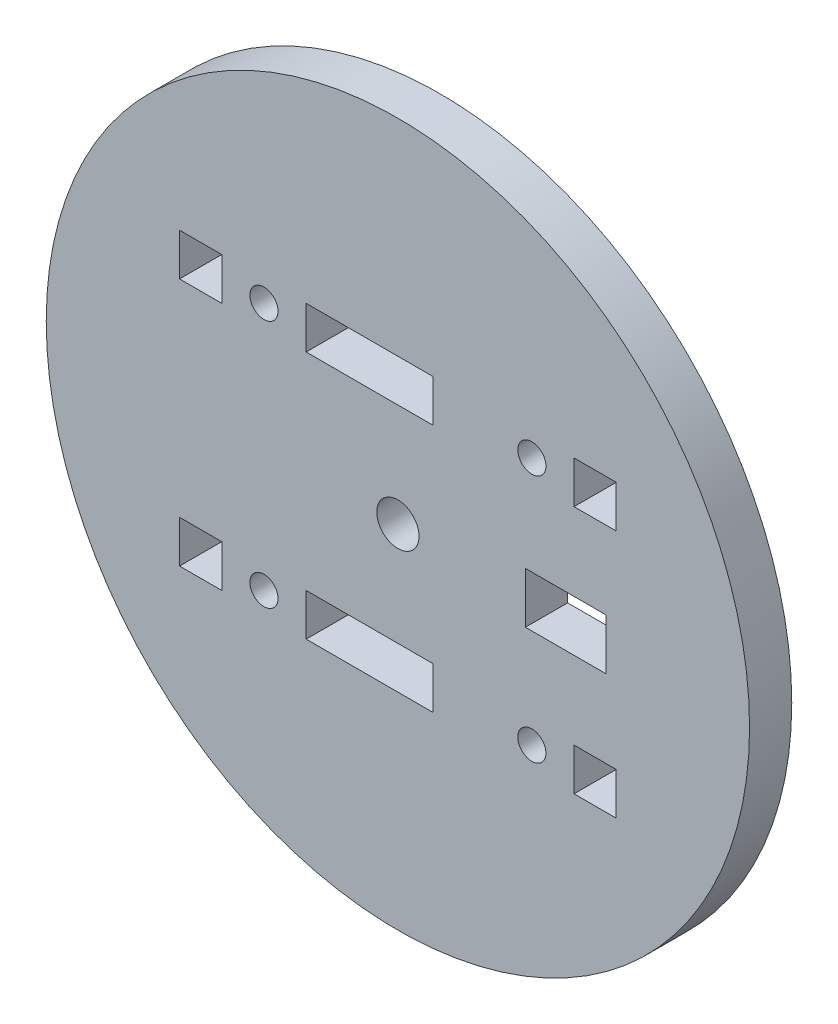
ISO-10303-21;
HEADER;
FILE_DESCRIPTION(('STEP AP214'),'2;1');
FILE_NAME('part.step','',(''),(''),'','','');
FILE_SCHEMA(('AUTOMOTIVE_DESIGN { 1 0 10303 214 1 1 1 1 }'));
ENDSEC;
DATA;
#1=APPLICATION_CONTEXT('core data for automotive mechanical design processes');
#2=APPLICATION_PROTOCOL_DEFINITION('international standard','automotive_design',2000,#1);
#3=PRODUCT_CONTEXT('',#1,'mechanical');
#4=PRODUCT('Part','Part','',(#3));
#5=PRODUCT_RELATED_PRODUCT_CATEGORY('part','',(#4));
#6=PRODUCT_DEFINITION_FORMATION('','',#4);
#7=PRODUCT_DEFINITION_CONTEXT('part definition',#1,'design');
#8=PRODUCT_DEFINITION('design','',#6,#7);
#9=PRODUCT_DEFINITION_SHAPE('','',#8);
#10=(LENGTH_UNIT() NAMED_UNIT(*) SI_UNIT(.MILLI.,.METRE.));
#11=(NAMED_UNIT(*) PLANE_ANGLE_UNIT() SI_UNIT($,.RADIAN.));
#12=(NAMED_UNIT(*) SI_UNIT($,.STERADIAN.) SOLID_ANGLE_UNIT());
#13=UNCERTAINTY_MEASURE_WITH_UNIT(LENGTH_MEASURE(1.E-05),#10,'distance_accuracy_value','');
#14=(GEOMETRIC_REPRESENTATION_CONTEXT(3) GLOBAL_UNCERTAINTY_ASSIGNED_CONTEXT((#13)) GLOBAL_UNIT_ASSIGNED_CONTEXT((#10,
#11,#12)) REPRESENTATION_CONTEXT('',''));
#15=CARTESIAN_POINT('',(0.,0.,0.));
#16=DIRECTION('',(0.,0.,1.));
#17=DIRECTION('',(1.,0.,0.));
#18=AXIS2_PLACEMENT_3D('',#15,#16,#17);
#19=CARTESIAN_POINT('',(0.,0.,15.));
#20=DIRECTION('',(0.,0.,1.));
#21=DIRECTION('',(1.,0.,0.));
#22=AXIS2_PLACEMENT_3D('',#19,#20,#21);
#23=PLANE('',#22);
#24=CARTESIAN_POINT('',(-47.6102535255947,-44.1941738241591,15.));
#25=DIRECTION('',(0.,0.,-1.));
#26=DIRECTION('',(1.,0.,0.));
#27=AXIS2_PLACEMENT_3D('',#24,#25,#26);
#28=CIRCLE('',#27,5.);
#29=CARTESIAN_POINT('',(-42.6102535255947,-44.1941738241591,15.));
#30=VERTEX_POINT('',#29);
#31=EDGE_CURVE('E250',#30,#30,#28,.T.);
#32=ORIENTED_EDGE('',*,*,#31,.T.);
#33=EDGE_LOOP('',(#32));
#34=FACE_BOUND('',#33,.T.);
#35=CARTESIAN_POINT('',(47.6102535255947,-44.1941738241591,15.));
#36=DIRECTION('',(0.,0.,-1.));
#37=DIRECTION('',(1.,0.,0.));
#38=AXIS2_PLACEMENT_3D('',#35,#36,#37);
#39=CIRCLE('',#38,5.);
#40=CARTESIAN_POINT('',(52.6102535255947,-44.1941738241591,15.));
#41=VERTEX_POINT('',#40);
#42=EDGE_CURVE('E257',#41,#41,#39,.T.);
#43=ORIENTED_EDGE('',*,*,#42,.T.);
#44=EDGE_LOOP('',(#43));
#45=FACE_BOUND('',#44,.T.);
#46=DIRECTION('',(-1.,0.,0.));
#47=VECTOR('',#46,1.);
#48=CARTESIAN_POINT('',(-32.6102535255947,51.6941738241591,15.));
#49=LINE('',#48,#47);
#50=CARTESIAN_POINT('',(12.3897464744053,51.6941738241591,15.));
#51=VERTEX_POINT('',#50);
#52=CARTESIAN_POINT('',(-32.6102535255947,51.6941738241591,15.));
#53=VERTEX_POINT('',#52);
#54=EDGE_CURVE('E321',#51,#53,#49,.T.);
#55=ORIENTED_EDGE('',*,*,#54,.F.);
#56=DIRECTION('',(0.,1.,0.));
#57=VECTOR('',#56,1.);
#58=CARTESIAN_POINT('',(12.3897464744053,51.6941738241591,15.));
#59=LINE('',#58,#57);
#60=CARTESIAN_POINT('',(12.3897464744053,36.6941738241591,15.));
#61=VERTEX_POINT('',#60);
#62=EDGE_CURVE('E332',#61,#51,#59,.T.);
#63=ORIENTED_EDGE('',*,*,#62,.F.);
#64=DIRECTION('',(1.,0.,0.));
#65=VECTOR('',#64,1.);
#66=CARTESIAN_POINT('',(-32.6102535255947,36.6941738241591,15.));
#67=LINE('',#66,#65);
#68=CARTESIAN_POINT('',(-32.6102535255947,36.6941738241591,15.));
#69=VERTEX_POINT('',#68);
#70=EDGE_CURVE('E346',#69,#61,#67,.T.);
#71=ORIENTED_EDGE('',*,*,#70,.F.);
#72=DIRECTION('',(0.,-1.,0.));
#73=VECTOR('',#72,1.);
#74=CARTESIAN_POINT('',(-32.6102535255947,51.6941738241591,15.));
#75=LINE('',#74,#73);
#76=EDGE_CURVE('E343',#53,#69,#75,.T.);
#77=ORIENTED_EDGE('',*,*,#76,.F.);
#78=EDGE_LOOP('',(#55,#63,#71,#77));
#79=FACE_BOUND('',#78,.T.);
#80=CARTESIAN_POINT('',(-47.6102535255947,44.1941738241591,15.));
#81=DIRECTION('',(0.,0.,1.));
#82=DIRECTION('',(1.,0.,0.));
#83=AXIS2_PLACEMENT_3D('',#80,#81,#82);
#84=CIRCLE('',#83,5.);
#85=CARTESIAN_POINT('',(-42.6102535255947,44.1941738241591,15.));
#86=VERTEX_POINT('',#85);
#87=EDGE_CURVE('E353',#86,#86,#84,.T.);
#88=ORIENTED_EDGE('',*,*,#87,.F.);
#89=EDGE_LOOP('',(#88));
#90=FACE_BOUND('',#89,.T.);
#91=CARTESIAN_POINT('',(47.6102535255947,44.1941738241591,15.));
#92=DIRECTION('',(0.,0.,1.));
#93=DIRECTION('',(1.,0.,0.));
#94=AXIS2_PLACEMENT_3D('',#91,#92,#93);
#95=CIRCLE('',#94,5.);
#96=CARTESIAN_POINT('',(52.6102535255947,44.1941738241591,15.));
#97=VERTEX_POINT('',#96);
#98=EDGE_CURVE('E363',#97,#97,#95,.T.);
#99=ORIENTED_EDGE('',*,*,#98,.F.);
#100=EDGE_LOOP('',(#99));
#101=FACE_BOUND('',#100,.T.);
#102=DIRECTION('',(0.,1.,0.));
#103=VECTOR('',#102,1.);
#104=CARTESIAN_POINT('',(73.9683398041064,-9.06,15.));
#105=LINE('',#104,#103);
#106=CARTESIAN_POINT('',(73.9683398041064,-9.06,15.));
#107=VERTEX_POINT('',#106);
#108=CARTESIAN_POINT('',(73.9683398041064,9.06,15.));
#109=VERTEX_POINT('',#108);
#110=EDGE_CURVE('E369',#107,#109,#105,.T.);
#111=ORIENTED_EDGE('',*,*,#110,.F.);
#112=DIRECTION('',(1.,0.,0.));
#113=VECTOR('',#112,1.);
#114=CARTESIAN_POINT('',(45.3283398041064,-9.06,15.));
#115=LINE('',#114,#113);
#116=CARTESIAN_POINT('',(45.3283398041064,-9.06,15.));
#117=VERTEX_POINT('',#116);
#118=EDGE_CURVE('E376',#117,#107,#115,.T.);
#119=ORIENTED_EDGE('',*,*,#118,.F.);
#120=DIRECTION('',(0.,-1.,0.));
#121=VECTOR('',#120,1.);
#122=CARTESIAN_POINT('',(45.3283398041064,-9.06,15.));
#123=LINE('',#122,#121);
#124=CARTESIAN_POINT('',(45.3283398041064,9.06,15.));
#125=VERTEX_POINT('',#124);
#126=EDGE_CURVE('E390',#125,#117,#123,.T.);
#127=ORIENTED_EDGE('',*,*,#126,.F.);
#128=DIRECTION('',(-1.,0.,0.));
#129=VECTOR('',#128,1.);
#130=CARTESIAN_POINT('',(45.3283398041064,9.06,15.));
#131=LINE('',#130,#129);
#132=EDGE_CURVE('E387',#109,#125,#131,.T.);
#133=ORIENTED_EDGE('',*,*,#132,.F.);
#134=EDGE_LOOP('',(#111,#119,#127,#133));
#135=FACE_BOUND('',#134,.T.);
#136=DIRECTION('',(0.,-1.,0.));
#137=VECTOR('',#136,1.);
#138=CARTESIAN_POINT('',(-77.6102535255947,36.6941738241591,15.));
#139=LINE('',#138,#137);
#140=CARTESIAN_POINT('',(-77.6102535255947,51.6941738241591,15.));
#141=VERTEX_POINT('',#140);
#142=CARTESIAN_POINT('',(-77.6102535255947,36.6941738241591,15.));
#143=VERTEX_POINT('',#142);
#144=EDGE_CURVE('E397',#141,#143,#139,.T.);
#145=ORIENTED_EDGE('',*,*,#144,.F.);
#146=DIRECTION('',(-1.,0.,0.));
#147=VECTOR('',#146,1.);
#148=CARTESIAN_POINT('',(-77.6102535255947,51.6941738241591,15.));
#149=LINE('',#148,#147);
#150=CARTESIAN_POINT('',(-62.6102535255947,51.6941738241591,15.));
#151=VERTEX_POINT('',#150);
#152=EDGE_CURVE('E408',#151,#141,#149,.T.);
#153=ORIENTED_EDGE('',*,*,#152,.F.);
#154=DIRECTION('',(0.,1.,0.));
#155=VECTOR('',#154,1.);
#156=CARTESIAN_POINT('',(-62.6102535255947,51.6941738241591,15.));
#157=LINE('',#156,#155);
#158=CARTESIAN_POINT('',(-62.6102535255947,36.6941738241591,15.));
#159=VERTEX_POINT('',#158);
#160=EDGE_CURVE('E422',#159,#151,#157,.T.);
#161=ORIENTED_EDGE('',*,*,#160,.F.);
#162=DIRECTION('',(1.,0.,0.));
#163=VECTOR('',#162,1.);
#164=CARTESIAN_POINT('',(-77.6102535255947,36.6941738241591,15.));
#165=LINE('',#164,#163);
#166=EDGE_CURVE('E419',#143,#159,#165,.T.);
#167=ORIENTED_EDGE('',*,*,#166,.F.);
#168=EDGE_LOOP('',(#145,#153,#161,#167));
#169=FACE_BOUND('',#168,.T.);
#170=DIRECTION('',(-1.,0.,0.));
#171=VECTOR('',#170,1.);
#172=CARTESIAN_POINT('',(62.6102535255947,51.6941738241591,15.));
#173=LINE('',#172,#171);
#174=CARTESIAN_POINT('',(77.6102535255947,51.6941738241591,15.));
#175=VERTEX_POINT('',#174);
#176=CARTESIAN_POINT('',(62.6102535255947,51.6941738241591,15.));
#177=VERTEX_POINT('',#176);
#178=EDGE_CURVE('E429',#175,#177,#173,.T.);
#179=ORIENTED_EDGE('',*,*,#178,.F.);
#180=DIRECTION('',(0.,1.,0.));
#181=VECTOR('',#180,1.);
#182=CARTESIAN_POINT('',(77.6102535255947,36.6941738241591,15.));
#183=LINE('',#182,#181);
#184=CARTESIAN_POINT('',(77.6102535255947,36.6941738241591,15.));
#185=VERTEX_POINT('',#184);
#186=EDGE_CURVE('E440',#185,#175,#183,.T.);
#187=ORIENTED_EDGE('',*,*,#186,.F.);
#188=DIRECTION('',(1.,0.,0.));
#189=VECTOR('',#188,1.);
#190=CARTESIAN_POINT('',(62.6102535255947,36.6941738241591,15.));
#191=LINE('',#190,#189);
#192=CARTESIAN_POINT('',(62.6102535255947,36.6941738241591,15.));
#193=VERTEX_POINT('',#192);
#194=EDGE_CURVE('E454',#193,#185,#191,.T.);
#195=ORIENTED_EDGE('',*,*,#194,.F.);
#196=DIRECTION('',(0.,-1.,0.));
#197=VECTOR('',#196,1.);
#198=CARTESIAN_POINT('',(62.6102535255947,51.6941738241591,15.));
#199=LINE('',#198,#197);
#200=EDGE_CURVE('E451',#177,#193,#199,.T.);
#201=ORIENTED_EDGE('',*,*,#200,.F.);
#202=EDGE_LOOP('',(#179,#187,#195,#201));
#203=FACE_BOUND('',#202,.T.);
#204=CARTESIAN_POINT('',(0.,0.,15.));
#205=DIRECTION('',(0.,0.,1.));
#206=DIRECTION('',(1.,0.,0.));
#207=AXIS2_PLACEMENT_3D('',#204,#205,#206);
#208=CIRCLE('',#207,7.5);
#209=CARTESIAN_POINT('',(7.5,0.,15.));
#210=VERTEX_POINT('',#209);
#211=EDGE_CURVE('E461',#210,#210,#208,.T.);
#212=ORIENTED_EDGE('',*,*,#211,.F.);
#213=EDGE_LOOP('',(#212));
#214=FACE_BOUND('',#213,.T.);
#215=CARTESIAN_POINT('',(0.,0.,15.));
#216=DIRECTION('',(0.,0.,1.));
#217=DIRECTION('',(1.,0.,0.));
#218=AXIS2_PLACEMENT_3D('',#215,#216,#217);
#219=CIRCLE('',#218,125.);
#220=CARTESIAN_POINT('',(125.,0.,15.));
#221=VERTEX_POINT('',#220);
#222=EDGE_CURVE('E11',#221,#221,#219,.T.);
#223=ORIENTED_EDGE('',*,*,#222,.T.);
#224=EDGE_LOOP('',(#223));
#225=FACE_BOUND('',#224,.T.);
#226=DIRECTION('',(0.,-1.,0.));
#227=VECTOR('',#226,1.);
#228=CARTESIAN_POINT('',(77.6102535255947,-36.6941738241591,15.));
#229=LINE('',#228,#227);
#230=CARTESIAN_POINT('',(77.6102535255947,-36.6941738241591,15.));
#231=VERTEX_POINT('',#230);
#232=CARTESIAN_POINT('',(77.6102535255947,-51.6941738241591,15.));
#233=VERTEX_POINT('',#232);
#234=EDGE_CURVE('E310',#231,#233,#229,.T.);
#235=ORIENTED_EDGE('',*,*,#234,.T.);
#236=DIRECTION('',(-1.,0.,0.));
#237=VECTOR('',#236,1.);
#238=CARTESIAN_POINT('',(62.6102535255947,-51.6941738241591,15.));
#239=LINE('',#238,#237);
#240=CARTESIAN_POINT('',(62.6102535255947,-51.6941738241591,15.));
#241=VERTEX_POINT('',#240);
#242=EDGE_CURVE('E290',#233,#241,#239,.T.);
#243=ORIENTED_EDGE('',*,*,#242,.T.);
#244=DIRECTION('',(0.,1.,0.));
#245=VECTOR('',#244,1.);
#246=CARTESIAN_POINT('',(62.6102535255947,-51.6941738241591,15.));
#247=LINE('',#246,#245);
#248=CARTESIAN_POINT('',(62.6102535255947,-36.6941738241591,15.));
#249=VERTEX_POINT('',#248);
#250=EDGE_CURVE('E300',#241,#249,#247,.T.);
#251=ORIENTED_EDGE('',*,*,#250,.T.);
#252=DIRECTION('',(1.,0.,0.));
#253=VECTOR('',#252,1.);
#254=CARTESIAN_POINT('',(62.6102535255947,-36.6941738241591,15.));
#255=LINE('',#254,#253);
#256=EDGE_CURVE('E313',#249,#231,#255,.T.);
#257=ORIENTED_EDGE('',*,*,#256,.T.);
#258=EDGE_LOOP('',(#235,#243,#251,#257));
#259=FACE_BOUND('',#258,.T.);
#260=DIRECTION('',(-1.,0.,0.));
#261=VECTOR('',#260,1.);
#262=CARTESIAN_POINT('',(-77.6102535255947,-51.6941738241591,15.));
#263=LINE('',#262,#261);
#264=CARTESIAN_POINT('',(-62.6102535255947,-51.6941738241591,15.));
#265=VERTEX_POINT('',#264);
#266=CARTESIAN_POINT('',(-77.6102535255947,-51.6941738241591,15.));
#267=VERTEX_POINT('',#266);
#268=EDGE_CURVE('E279',#265,#267,#263,.T.);
#269=ORIENTED_EDGE('',*,*,#268,.T.);
#270=DIRECTION('',(0.,1.,0.));
#271=VECTOR('',#270,1.);
#272=CARTESIAN_POINT('',(-77.6102535255947,-36.6941738241591,15.));
#273=LINE('',#272,#271);
#274=CARTESIAN_POINT('',(-77.6102535255947,-36.6941738241591,15.));
#275=VERTEX_POINT('',#274);
#276=EDGE_CURVE('E263',#267,#275,#273,.T.);
#277=ORIENTED_EDGE('',*,*,#276,.T.);
#278=DIRECTION('',(1.,0.,0.));
#279=VECTOR('',#278,1.);
#280=CARTESIAN_POINT('',(-77.6102535255947,-36.6941738241591,15.));
#281=LINE('',#280,#279);
#282=CARTESIAN_POINT('',(-62.6102535255947,-36.6941738241591,15.));
#283=VERTEX_POINT('',#282);
#284=EDGE_CURVE('E269',#275,#283,#281,.T.);
#285=ORIENTED_EDGE('',*,*,#284,.T.);
#286=DIRECTION('',(0.,-1.,0.));
#287=VECTOR('',#286,1.);
#288=CARTESIAN_POINT('',(-62.6102535255947,-51.6941738241591,15.));
#289=LINE('',#288,#287);
#290=EDGE_CURVE('E282',#283,#265,#289,.T.);
#291=ORIENTED_EDGE('',*,*,#290,.T.);
#292=EDGE_LOOP('',(#269,#277,#285,#291));
#293=FACE_BOUND('',#292,.T.);
#294=DIRECTION('',(0.,-1.,0.));
#295=VECTOR('',#294,1.);
#296=CARTESIAN_POINT('',(12.3897464744053,-51.6941738241591,15.));
#297=LINE('',#296,#295);
#298=CARTESIAN_POINT('',(12.3897464744053,-36.6941738241591,15.));
#299=VERTEX_POINT('',#298);
#300=CARTESIAN_POINT('',(12.3897464744053,-51.6941738241591,15.));
#301=VERTEX_POINT('',#300);
#302=EDGE_CURVE('E244',#299,#301,#297,.T.);
#303=ORIENTED_EDGE('',*,*,#302,.T.);
#304=DIRECTION('',(-1.,0.,0.));
#305=VECTOR('',#304,1.);
#306=CARTESIAN_POINT('',(-32.6102535255947,-51.6941738241591,15.));
#307=LINE('',#306,#305);
#308=CARTESIAN_POINT('',(-32.6102535255947,-51.6941738241591,15.));
#309=VERTEX_POINT('',#308);
#310=EDGE_CURVE('E49',#301,#309,#307,.T.);
#311=ORIENTED_EDGE('',*,*,#310,.T.);
#312=DIRECTION('',(0.,1.,0.));
#313=VECTOR('',#312,1.);
#314=CARTESIAN_POINT('',(-32.6102535255947,-51.6941738241591,15.));
#315=LINE('',#314,#313);
#316=CARTESIAN_POINT('',(-32.6102535255947,-36.6941738241591,15.));
#317=VERTEX_POINT('',#316);
#318=EDGE_CURVE('E235',#309,#317,#315,.T.);
#319=ORIENTED_EDGE('',*,*,#318,.T.);
#320=DIRECTION('',(1.,0.,0.));
#321=VECTOR('',#320,1.);
#322=CARTESIAN_POINT('',(-32.6102535255947,-36.6941738241591,15.));
#323=LINE('',#322,#321);
#324=EDGE_CURVE('E238',#317,#299,#323,.T.);
#325=ORIENTED_EDGE('',*,*,#324,.T.);
#326=EDGE_LOOP('',(#303,#311,#319,#325));
#327=FACE_BOUND('',#326,.T.);
#328=ADVANCED_FACE('F34',(#34,#45,#79,#90,#101,#135,#169,#203,#214,#225,#259,#293,#327),#23,.T.);
#329=CARTESIAN_POINT('',(0.,0.,0.));
#330=DIRECTION('',(0.,0.,1.));
#331=DIRECTION('',(1.,0.,0.));
#332=AXIS2_PLACEMENT_3D('',#329,#330,#331);
#333=PLANE('',#332);
#334=DIRECTION('',(0.,1.,0.));
#335=VECTOR('',#334,1.);
#336=CARTESIAN_POINT('',(-77.6102535255947,-36.6941738241591,0.));
#337=LINE('',#336,#335);
#338=CARTESIAN_POINT('',(-77.6102535255947,-51.6941738241591,0.));
#339=VERTEX_POINT('',#338);
#340=CARTESIAN_POINT('',(-77.6102535255947,-36.6941738241591,0.));
#341=VERTEX_POINT('',#340);
#342=EDGE_CURVE('E266',#339,#341,#337,.T.);
#343=ORIENTED_EDGE('',*,*,#342,.F.);
#344=DIRECTION('',(-1.,0.,0.));
#345=VECTOR('',#344,1.);
#346=CARTESIAN_POINT('',(-77.6102535255947,-51.6941738241591,0.));
#347=LINE('',#346,#345);
#348=CARTESIAN_POINT('',(-62.6102535255947,-51.6941738241591,0.));
#349=VERTEX_POINT('',#348);
#350=EDGE_CURVE('E268',#349,#339,#347,.T.);
#351=ORIENTED_EDGE('',*,*,#350,.F.);
#352=DIRECTION('',(0.,-1.,0.));
#353=VECTOR('',#352,1.);
#354=CARTESIAN_POINT('',(-62.6102535255947,-51.6941738241591,0.));
#355=LINE('',#354,#353);
#356=CARTESIAN_POINT('',(-62.6102535255947,-36.6941738241591,0.));
#357=VERTEX_POINT('',#356);
#358=EDGE_CURVE('E271',#357,#349,#355,.T.);
#359=ORIENTED_EDGE('',*,*,#358,.F.);
#360=DIRECTION('',(1.,0.,0.));
#361=VECTOR('',#360,1.);
#362=CARTESIAN_POINT('',(-77.6102535255947,-36.6941738241591,0.));
#363=LINE('',#362,#361);
#364=EDGE_CURVE('E274',#341,#357,#363,.T.);
#365=ORIENTED_EDGE('',*,*,#364,.F.);
#366=EDGE_LOOP('',(#343,#351,#359,#365));
#367=FACE_BOUND('',#366,.T.);
#368=CARTESIAN_POINT('',(0.,0.,0.));
#369=DIRECTION('',(0.,0.,1.));
#370=DIRECTION('',(1.,0.,0.));
#371=AXIS2_PLACEMENT_3D('',#368,#369,#370);
#372=CIRCLE('',#371,125.);
#373=CARTESIAN_POINT('',(125.,0.,0.));
#374=VERTEX_POINT('',#373);
#375=EDGE_CURVE('E38',#374,#374,#372,.T.);
#376=ORIENTED_EDGE('',*,*,#375,.F.);
#377=EDGE_LOOP('',(#376));
#378=FACE_BOUND('',#377,.T.);
#379=CARTESIAN_POINT('',(0.,0.,0.));
#380=DIRECTION('',(0.,0.,1.));
#381=DIRECTION('',(1.,0.,0.));
#382=AXIS2_PLACEMENT_3D('',#379,#380,#381);
#383=CIRCLE('',#382,7.5);
#384=CARTESIAN_POINT('',(7.5,0.,0.));
#385=VERTEX_POINT('',#384);
#386=EDGE_CURVE('E468',#385,#385,#383,.T.);
#387=ORIENTED_EDGE('',*,*,#386,.T.);
#388=EDGE_LOOP('',(#387));
#389=FACE_BOUND('',#388,.T.);
#390=DIRECTION('',(0.,1.,0.));
#391=VECTOR('',#390,1.);
#392=CARTESIAN_POINT('',(77.6102535255947,36.6941738241591,0.));
#393=LINE('',#392,#391);
#394=CARTESIAN_POINT('',(77.6102535255947,36.6941738241591,0.));
#395=VERTEX_POINT('',#394);
#396=CARTESIAN_POINT('',(77.6102535255947,51.6941738241591,0.));
#397=VERTEX_POINT('',#396);
#398=EDGE_CURVE('E446',#395,#397,#393,.T.);
#399=ORIENTED_EDGE('',*,*,#398,.T.);
#400=DIRECTION('',(-1.,0.,0.));
#401=VECTOR('',#400,1.);
#402=CARTESIAN_POINT('',(62.6102535255947,51.6941738241591,0.));
#403=LINE('',#402,#401);
#404=CARTESIAN_POINT('',(62.6102535255947,51.6941738241591,0.));
#405=VERTEX_POINT('',#404);
#406=EDGE_CURVE('E436',#397,#405,#403,.T.);
#407=ORIENTED_EDGE('',*,*,#406,.T.);
#408=DIRECTION('',(0.,-1.,0.));
#409=VECTOR('',#408,1.);
#410=CARTESIAN_POINT('',(62.6102535255947,51.6941738241591,0.));
#411=LINE('',#410,#409);
#412=CARTESIAN_POINT('',(62.6102535255947,36.6941738241591,0.));
#413=VERTEX_POINT('',#412);
#414=EDGE_CURVE('E439',#405,#413,#411,.T.);
#415=ORIENTED_EDGE('',*,*,#414,.T.);
#416=DIRECTION('',(1.,0.,0.));
#417=VECTOR('',#416,1.);
#418=CARTESIAN_POINT('',(62.6102535255947,36.6941738241591,0.));
#419=LINE('',#418,#417);
#420=EDGE_CURVE('E443',#413,#395,#419,.T.);
#421=ORIENTED_EDGE('',*,*,#420,.T.);
#422=EDGE_LOOP('',(#399,#407,#415,#421));
#423=FACE_BOUND('',#422,.T.);
#424=DIRECTION('',(-1.,0.,0.));
#425=VECTOR('',#424,1.);
#426=CARTESIAN_POINT('',(-77.6102535255947,51.6941738241591,0.));
#427=LINE('',#426,#425);
#428=CARTESIAN_POINT('',(-62.6102535255947,51.6941738241591,0.));
#429=VERTEX_POINT('',#428);
#430=CARTESIAN_POINT('',(-77.6102535255947,51.6941738241591,0.));
#431=VERTEX_POINT('',#430);
#432=EDGE_CURVE('E414',#429,#431,#427,.T.);
#433=ORIENTED_EDGE('',*,*,#432,.T.);
#434=DIRECTION('',(0.,-1.,0.));
#435=VECTOR('',#434,1.);
#436=CARTESIAN_POINT('',(-77.6102535255947,36.6941738241591,0.));
#437=LINE('',#436,#435);
#438=CARTESIAN_POINT('',(-77.6102535255947,36.6941738241591,0.));
#439=VERTEX_POINT('',#438);
#440=EDGE_CURVE('E404',#431,#439,#437,.T.);
#441=ORIENTED_EDGE('',*,*,#440,.T.);
#442=DIRECTION('',(1.,0.,0.));
#443=VECTOR('',#442,1.);
#444=CARTESIAN_POINT('',(-77.6102535255947,36.6941738241591,0.));
#445=LINE('',#444,#443);
#446=CARTESIAN_POINT('',(-62.6102535255947,36.6941738241591,0.));
#447=VERTEX_POINT('',#446);
#448=EDGE_CURVE('E407',#439,#447,#445,.T.);
#449=ORIENTED_EDGE('',*,*,#448,.T.);
#450=DIRECTION('',(0.,1.,0.));
#451=VECTOR('',#450,1.);
#452=CARTESIAN_POINT('',(-62.6102535255947,51.6941738241591,0.));
#453=LINE('',#452,#451);
#454=EDGE_CURVE('E411',#447,#429,#453,.T.);
#455=ORIENTED_EDGE('',*,*,#454,.T.);
#456=EDGE_LOOP('',(#433,#441,#449,#455));
#457=FACE_BOUND('',#456,.T.);
#458=DIRECTION('',(1.,0.,0.));
#459=VECTOR('',#458,1.);
#460=CARTESIAN_POINT('',(45.3283398041064,-9.06,0.));
#461=LINE('',#460,#459);
#462=CARTESIAN_POINT('',(45.3283398041064,-9.06,0.));
#463=VERTEX_POINT('',#462);
#464=CARTESIAN_POINT('',(73.9683398041064,-9.06,0.));
#465=VERTEX_POINT('',#464);
#466=EDGE_CURVE('E382',#463,#465,#461,.T.);
#467=ORIENTED_EDGE('',*,*,#466,.T.);
#468=DIRECTION('',(0.,1.,0.));
#469=VECTOR('',#468,1.);
#470=CARTESIAN_POINT('',(73.9683398041064,-9.06,0.));
#471=LINE('',#470,#469);
#472=CARTESIAN_POINT('',(73.9683398041064,9.06,0.));
#473=VERTEX_POINT('',#472);
#474=EDGE_CURVE('E372',#465,#473,#471,.T.);
#475=ORIENTED_EDGE('',*,*,#474,.T.);
#476=DIRECTION('',(-1.,0.,0.));
#477=VECTOR('',#476,1.);
#478=CARTESIAN_POINT('',(45.3283398041064,9.06,0.));
#479=LINE('',#478,#477);
#480=CARTESIAN_POINT('',(45.3283398041064,9.06,0.));
#481=VERTEX_POINT('',#480);
#482=EDGE_CURVE('E375',#473,#481,#479,.T.);
#483=ORIENTED_EDGE('',*,*,#482,.T.);
#484=DIRECTION('',(0.,-1.,0.));
#485=VECTOR('',#484,1.);
#486=CARTESIAN_POINT('',(45.3283398041064,-9.06,0.));
#487=LINE('',#486,#485);
#488=EDGE_CURVE('E379',#481,#463,#487,.T.);
#489=ORIENTED_EDGE('',*,*,#488,.T.);
#490=EDGE_LOOP('',(#467,#475,#483,#489));
#491=FACE_BOUND('',#490,.T.);
#492=CARTESIAN_POINT('',(47.6102535255947,44.1941738241591,0.));
#493=DIRECTION('',(0.,0.,1.));
#494=DIRECTION('',(1.,0.,0.));
#495=AXIS2_PLACEMENT_3D('',#492,#493,#494);
#496=CIRCLE('',#495,5.);
#497=CARTESIAN_POINT('',(52.6102535255947,44.1941738241591,0.));
#498=VERTEX_POINT('',#497);
#499=EDGE_CURVE('E366',#498,#498,#496,.T.);
#500=ORIENTED_EDGE('',*,*,#499,.T.);
#501=EDGE_LOOP('',(#500));
#502=FACE_BOUND('',#501,.T.);
#503=CARTESIAN_POINT('',(-47.6102535255947,44.1941738241591,0.));
#504=DIRECTION('',(0.,0.,1.));
#505=DIRECTION('',(1.,0.,0.));
#506=AXIS2_PLACEMENT_3D('',#503,#504,#505);
#507=CIRCLE('',#506,5.);
#508=CARTESIAN_POINT('',(-42.6102535255947,44.1941738241591,0.));
#509=VERTEX_POINT('',#508);
#510=EDGE_CURVE('E360',#509,#509,#507,.T.);
#511=ORIENTED_EDGE('',*,*,#510,.T.);
#512=EDGE_LOOP('',(#511));
#513=FACE_BOUND('',#512,.T.);
#514=DIRECTION('',(0.,1.,0.));
#515=VECTOR('',#514,1.);
#516=CARTESIAN_POINT('',(12.3897464744053,51.6941738241591,0.));
#517=LINE('',#516,#515);
#518=CARTESIAN_POINT('',(12.3897464744053,36.6941738241591,0.));
#519=VERTEX_POINT('',#518);
#520=CARTESIAN_POINT('',(12.3897464744053,51.6941738241591,0.));
#521=VERTEX_POINT('',#520);
#522=EDGE_CURVE('E338',#519,#521,#517,.T.);
#523=ORIENTED_EDGE('',*,*,#522,.T.);
#524=DIRECTION('',(-1.,0.,0.));
#525=VECTOR('',#524,1.);
#526=CARTESIAN_POINT('',(-32.6102535255947,51.6941738241591,0.));
#527=LINE('',#526,#525);
#528=CARTESIAN_POINT('',(-32.6102535255947,51.6941738241591,0.));
#529=VERTEX_POINT('',#528);
#530=EDGE_CURVE('E328',#521,#529,#527,.T.);
#531=ORIENTED_EDGE('',*,*,#530,.T.);
#532=DIRECTION('',(0.,-1.,0.));
#533=VECTOR('',#532,1.);
#534=CARTESIAN_POINT('',(-32.6102535255947,51.6941738241591,0.));
#535=LINE('',#534,#533);
#536=CARTESIAN_POINT('',(-32.6102535255947,36.6941738241591,0.));
#537=VERTEX_POINT('',#536);
#538=EDGE_CURVE('E331',#529,#537,#535,.T.);
#539=ORIENTED_EDGE('',*,*,#538,.T.);
#540=DIRECTION('',(1.,0.,0.));
#541=VECTOR('',#540,1.);
#542=CARTESIAN_POINT('',(-32.6102535255947,36.6941738241591,0.));
#543=LINE('',#542,#541);
#544=EDGE_CURVE('E335',#537,#519,#543,.T.);
#545=ORIENTED_EDGE('',*,*,#544,.T.);
#546=EDGE_LOOP('',(#523,#531,#539,#545));
#547=FACE_BOUND('',#546,.T.);
#548=DIRECTION('',(-1.,0.,0.));
#549=VECTOR('',#548,1.);
#550=CARTESIAN_POINT('',(62.6102535255947,-51.6941738241591,0.));
#551=LINE('',#550,#549);
#552=CARTESIAN_POINT('',(77.6102535255947,-51.6941738241591,0.));
#553=VERTEX_POINT('',#552);
#554=CARTESIAN_POINT('',(62.6102535255947,-51.6941738241591,0.));
#555=VERTEX_POINT('',#554);
#556=EDGE_CURVE('E297',#553,#555,#551,.T.);
#557=ORIENTED_EDGE('',*,*,#556,.F.);
#558=DIRECTION('',(0.,-1.,0.));
#559=VECTOR('',#558,1.);
#560=CARTESIAN_POINT('',(77.6102535255947,-36.6941738241591,0.));
#561=LINE('',#560,#559);
#562=CARTESIAN_POINT('',(77.6102535255947,-36.6941738241591,0.));
#563=VERTEX_POINT('',#562);
#564=EDGE_CURVE('E299',#563,#553,#561,.T.);
#565=ORIENTED_EDGE('',*,*,#564,.F.);
#566=DIRECTION('',(1.,0.,0.));
#567=VECTOR('',#566,1.);
#568=CARTESIAN_POINT('',(62.6102535255947,-36.6941738241591,0.));
#569=LINE('',#568,#567);
#570=CARTESIAN_POINT('',(62.6102535255947,-36.6941738241591,0.));
#571=VERTEX_POINT('',#570);
#572=EDGE_CURVE('E302',#571,#563,#569,.T.);
#573=ORIENTED_EDGE('',*,*,#572,.F.);
#574=DIRECTION('',(0.,1.,0.));
#575=VECTOR('',#574,1.);
#576=CARTESIAN_POINT('',(62.6102535255947,-51.6941738241591,0.));
#577=LINE('',#576,#575);
#578=EDGE_CURVE('E305',#555,#571,#577,.T.);
#579=ORIENTED_EDGE('',*,*,#578,.F.);
#580=EDGE_LOOP('',(#557,#565,#573,#579));
#581=FACE_BOUND('',#580,.T.);
#582=CARTESIAN_POINT('',(47.6102535255947,-44.1941738241591,0.));
#583=DIRECTION('',(0.,0.,-1.));
#584=DIRECTION('',(1.,0.,0.));
#585=AXIS2_PLACEMENT_3D('',#582,#583,#584);
#586=CIRCLE('',#585,5.);
#587=CARTESIAN_POINT('',(52.6102535255947,-44.1941738241591,0.));
#588=VERTEX_POINT('',#587);
#589=EDGE_CURVE('E260',#588,#588,#586,.T.);
#590=ORIENTED_EDGE('',*,*,#589,.F.);
#591=EDGE_LOOP('',(#590));
#592=FACE_BOUND('',#591,.T.);
#593=CARTESIAN_POINT('',(-47.6102535255947,-44.1941738241591,0.));
#594=DIRECTION('',(0.,0.,-1.));
#595=DIRECTION('',(1.,0.,0.));
#596=AXIS2_PLACEMENT_3D('',#593,#594,#595);
#597=CIRCLE('',#596,5.);
#598=CARTESIAN_POINT('',(-42.6102535255947,-44.1941738241591,0.));
#599=VERTEX_POINT('',#598);
#600=EDGE_CURVE('E254',#599,#599,#597,.T.);
#601=ORIENTED_EDGE('',*,*,#600,.F.);
#602=EDGE_LOOP('',(#601));
#603=FACE_BOUND('',#602,.T.);
#604=DIRECTION('',(-1.,0.,0.));
#605=VECTOR('',#604,1.);
#606=CARTESIAN_POINT('',(-32.6102535255947,-51.6941738241591,0.));
#607=LINE('',#606,#605);
#608=CARTESIAN_POINT('',(12.3897464744053,-51.6941738241591,0.));
#609=VERTEX_POINT('',#608);
#610=CARTESIAN_POINT('',(-32.6102535255947,-51.6941738241591,0.));
#611=VERTEX_POINT('',#610);
#612=EDGE_CURVE('E227',#609,#611,#607,.T.);
#613=ORIENTED_EDGE('',*,*,#612,.F.);
#614=DIRECTION('',(0.,-1.,0.));
#615=VECTOR('',#614,1.);
#616=CARTESIAN_POINT('',(12.3897464744053,-51.6941738241591,0.));
#617=LINE('',#616,#615);
#618=CARTESIAN_POINT('',(12.3897464744053,-36.6941738241591,0.));
#619=VERTEX_POINT('',#618);
#620=EDGE_CURVE('E219',#619,#609,#617,.T.);
#621=ORIENTED_EDGE('',*,*,#620,.F.);
#622=DIRECTION('',(1.,0.,0.));
#623=VECTOR('',#622,1.);
#624=CARTESIAN_POINT('',(-32.6102535255947,-36.6941738241591,0.));
#625=LINE('',#624,#623);
#626=CARTESIAN_POINT('',(-32.6102535255947,-36.6941738241591,0.));
#627=VERTEX_POINT('',#626);
#628=EDGE_CURVE('E226',#627,#619,#625,.T.);
#629=ORIENTED_EDGE('',*,*,#628,.F.);
#630=DIRECTION('',(0.,1.,0.));
#631=VECTOR('',#630,1.);
#632=CARTESIAN_POINT('',(-32.6102535255947,-51.6941738241591,0.));
#633=LINE('',#632,#631);
#634=EDGE_CURVE('E231',#611,#627,#633,.T.);
#635=ORIENTED_EDGE('',*,*,#634,.F.);
#636=EDGE_LOOP('',(#613,#621,#629,#635));
#637=FACE_BOUND('',#636,.T.);
#638=ADVANCED_FACE('F234',(#367,#378,#389,#423,#457,#491,#502,#513,#547,#581,#592,#603,#637),
#333,.F.);
#639=CARTESIAN_POINT('',(0.,0.,15.));
#640=DIRECTION('',(0.,0.,-1.));
#641=DIRECTION('',(-1.,0.,0.));
#642=AXIS2_PLACEMENT_3D('',#639,#640,#641);
#643=CYLINDRICAL_SURFACE('',#642,125.);
#644=ORIENTED_EDGE('',*,*,#222,.F.);
#645=EDGE_LOOP('',(#644));
#646=FACE_BOUND('',#645,.T.);
#647=ORIENTED_EDGE('',*,*,#375,.T.);
#648=EDGE_LOOP('',(#647));
#649=FACE_BOUND('',#648,.T.);
#650=ADVANCED_FACE('F36',(#646,#649),#643,.T.);
#651=CARTESIAN_POINT('',(0.,0.,0.));
#652=DIRECTION('',(0.,0.,1.));
#653=DIRECTION('',(1.,0.,0.));
#654=AXIS2_PLACEMENT_3D('',#651,#652,#653);
#655=CYLINDRICAL_SURFACE('',#654,7.5);
#656=ORIENTED_EDGE('',*,*,#386,.F.);
#657=EDGE_LOOP('',(#656));
#658=FACE_BOUND('',#657,.T.);
#659=ORIENTED_EDGE('',*,*,#211,.T.);
#660=EDGE_LOOP('',(#659));
#661=FACE_BOUND('',#660,.T.);
#662=ADVANCED_FACE('F474',(#658,#661),#655,.F.);
#663=CARTESIAN_POINT('',(62.6102535255947,51.6941738241591,0.));
#664=DIRECTION('',(0.,1.,0.));
#665=DIRECTION('',(-1.,0.,0.));
#666=AXIS2_PLACEMENT_3D('',#663,#664,#665);
#667=PLANE('',#666);
#668=ORIENTED_EDGE('',*,*,#178,.T.);
#669=DIRECTION('',(0.,0.,1.));
#670=VECTOR('',#669,1.);
#671=CARTESIAN_POINT('',(62.6102535255947,51.6941738241591,0.));
#672=LINE('',#671,#670);
#673=EDGE_CURVE('E449',#405,#177,#672,.T.);
#674=ORIENTED_EDGE('',*,*,#673,.F.);
#675=ORIENTED_EDGE('',*,*,#406,.F.);
#676=DIRECTION('',(0.,0.,1.));
#677=VECTOR('',#676,1.);
#678=CARTESIAN_POINT('',(77.6102535255947,51.6941738241591,0.));
#679=LINE('',#678,#677);
#680=EDGE_CURVE('E459',#397,#175,#679,.T.);
#681=ORIENTED_EDGE('',*,*,#680,.T.);
#682=EDGE_LOOP('',(#668,#674,#675,#681));
#683=FACE_BOUND('',#682,.T.);
#684=ADVANCED_FACE('F604',(#683),#667,.F.);
#685=CARTESIAN_POINT('',(77.6102535255947,36.6941738241591,0.));
#686=DIRECTION('',(1.,0.,0.));
#687=DIRECTION('',(0.,0.,-1.));
#688=AXIS2_PLACEMENT_3D('',#685,#686,#687);
#689=PLANE('',#688);
#690=ORIENTED_EDGE('',*,*,#186,.T.);
#691=ORIENTED_EDGE('',*,*,#680,.F.);
#692=ORIENTED_EDGE('',*,*,#398,.F.);
#693=DIRECTION('',(0.,0.,1.));
#694=VECTOR('',#693,1.);
#695=CARTESIAN_POINT('',(77.6102535255947,36.6941738241591,0.));
#696=LINE('',#695,#694);
#697=EDGE_CURVE('E462',#395,#185,#696,.T.);
#698=ORIENTED_EDGE('',*,*,#697,.T.);
#699=EDGE_LOOP('',(#690,#691,#692,#698));
#700=FACE_BOUND('',#699,.T.);
#701=ADVANCED_FACE('F600',(#700),#689,.F.);
#702=CARTESIAN_POINT('',(62.6102535255947,36.6941738241591,0.));
#703=DIRECTION('',(0.,-1.,0.));
#704=DIRECTION('',(0.,0.,-1.));
#705=AXIS2_PLACEMENT_3D('',#702,#703,#704);
#706=PLANE('',#705);
#707=ORIENTED_EDGE('',*,*,#194,.T.);
#708=ORIENTED_EDGE('',*,*,#697,.F.);
#709=ORIENTED_EDGE('',*,*,#420,.F.);
#710=DIRECTION('',(0.,0.,1.));
#711=VECTOR('',#710,1.);
#712=CARTESIAN_POINT('',(62.6102535255947,36.6941738241591,0.));
#713=LINE('',#712,#711);
#714=EDGE_CURVE('E464',#413,#193,#713,.T.);
#715=ORIENTED_EDGE('',*,*,#714,.T.);
#716=EDGE_LOOP('',(#707,#708,#709,#715));
#717=FACE_BOUND('',#716,.T.);
#718=ADVANCED_FACE('F603',(#717),#706,.F.);
#719=CARTESIAN_POINT('',(62.6102535255947,51.6941738241591,0.));
#720=DIRECTION('',(-1.,0.,0.));
#721=DIRECTION('',(0.,0.,1.));
#722=AXIS2_PLACEMENT_3D('',#719,#720,#721);
#723=PLANE('',#722);
#724=ORIENTED_EDGE('',*,*,#200,.T.);
#725=ORIENTED_EDGE('',*,*,#714,.F.);
#726=ORIENTED_EDGE('',*,*,#414,.F.);
#727=ORIENTED_EDGE('',*,*,#673,.T.);
#728=EDGE_LOOP('',(#724,#725,#726,#727));
#729=FACE_BOUND('',#728,.T.);
#730=ADVANCED_FACE('F598',(#729),#723,.F.);
#731=CARTESIAN_POINT('',(-77.6102535255947,36.6941738241591,0.));
#732=DIRECTION('',(-1.,0.,0.));
#733=DIRECTION('',(0.,0.,1.));
#734=AXIS2_PLACEMENT_3D('',#731,#732,#733);
#735=PLANE('',#734);
#736=ORIENTED_EDGE('',*,*,#144,.T.);
#737=DIRECTION('',(0.,0.,1.));
#738=VECTOR('',#737,1.);
#739=CARTESIAN_POINT('',(-77.6102535255947,36.6941738241591,0.));
#740=LINE('',#739,#738);
#741=EDGE_CURVE('E417',#439,#143,#740,.T.);
#742=ORIENTED_EDGE('',*,*,#741,.F.);
#743=ORIENTED_EDGE('',*,*,#440,.F.);
#744=DIRECTION('',(0.,0.,1.));
#745=VECTOR('',#744,1.);
#746=CARTESIAN_POINT('',(-77.6102535255947,51.6941738241591,0.));
#747=LINE('',#746,#745);
#748=EDGE_CURVE('E427',#431,#141,#747,.T.);
#749=ORIENTED_EDGE('',*,*,#748,.T.);
#750=EDGE_LOOP('',(#736,#742,#743,#749));
#751=FACE_BOUND('',#750,.T.);
#752=ADVANCED_FACE('F588',(#751),#735,.F.);
#753=CARTESIAN_POINT('',(-77.6102535255947,51.6941738241591,0.));
#754=DIRECTION('',(0.,1.,0.));
#755=DIRECTION('',(-1.,0.,0.));
#756=AXIS2_PLACEMENT_3D('',#753,#754,#755);
#757=PLANE('',#756);
#758=ORIENTED_EDGE('',*,*,#152,.T.);
#759=ORIENTED_EDGE('',*,*,#748,.F.);
#760=ORIENTED_EDGE('',*,*,#432,.F.);
#761=DIRECTION('',(0.,0.,1.));
#762=VECTOR('',#761,1.);
#763=CARTESIAN_POINT('',(-62.6102535255947,51.6941738241591,0.));
#764=LINE('',#763,#762);
#765=EDGE_CURVE('E430',#429,#151,#764,.T.);
#766=ORIENTED_EDGE('',*,*,#765,.T.);
#767=EDGE_LOOP('',(#758,#759,#760,#766));
#768=FACE_BOUND('',#767,.T.);
#769=ADVANCED_FACE('F584',(#768),#757,.F.);
#770=CARTESIAN_POINT('',(-62.6102535255947,51.6941738241591,0.));
#771=DIRECTION('',(1.,0.,0.));
#772=DIRECTION('',(0.,0.,-1.));
#773=AXIS2_PLACEMENT_3D('',#770,#771,#772);
#774=PLANE('',#773);
#775=ORIENTED_EDGE('',*,*,#160,.T.);
#776=ORIENTED_EDGE('',*,*,#765,.F.);
#777=ORIENTED_EDGE('',*,*,#454,.F.);
#778=DIRECTION('',(0.,0.,1.));
#779=VECTOR('',#778,1.);
#780=CARTESIAN_POINT('',(-62.6102535255947,36.6941738241591,0.));
#781=LINE('',#780,#779);
#782=EDGE_CURVE('E432',#447,#159,#781,.T.);
#783=ORIENTED_EDGE('',*,*,#782,.T.);
#784=EDGE_LOOP('',(#775,#776,#777,#783));
#785=FACE_BOUND('',#784,.T.);
#786=ADVANCED_FACE('F587',(#785),#774,.F.);
#787=CARTESIAN_POINT('',(-77.6102535255947,36.6941738241591,0.));
#788=DIRECTION('',(0.,-1.,0.));
#789=DIRECTION('',(0.,0.,-1.));
#790=AXIS2_PLACEMENT_3D('',#787,#788,#789);
#791=PLANE('',#790);
#792=ORIENTED_EDGE('',*,*,#166,.T.);
#793=ORIENTED_EDGE('',*,*,#782,.F.);
#794=ORIENTED_EDGE('',*,*,#448,.F.);
#795=ORIENTED_EDGE('',*,*,#741,.T.);
#796=EDGE_LOOP('',(#792,#793,#794,#795));
#797=FACE_BOUND('',#796,.T.);
#798=ADVANCED_FACE('F582',(#797),#791,.F.);
#799=CARTESIAN_POINT('',(73.9683398041064,-9.06,0.));
#800=DIRECTION('',(1.,0.,0.));
#801=DIRECTION('',(0.,0.,-1.));
#802=AXIS2_PLACEMENT_3D('',#799,#800,#801);
#803=PLANE('',#802);
#804=ORIENTED_EDGE('',*,*,#110,.T.);
#805=DIRECTION('',(0.,0.,1.));
#806=VECTOR('',#805,1.);
#807=CARTESIAN_POINT('',(73.9683398041064,9.06,0.));
#808=LINE('',#807,#806);
#809=EDGE_CURVE('E385',#473,#109,#808,.T.);
#810=ORIENTED_EDGE('',*,*,#809,.F.);
#811=ORIENTED_EDGE('',*,*,#474,.F.);
#812=DIRECTION('',(0.,0.,1.));
#813=VECTOR('',#812,1.);
#814=CARTESIAN_POINT('',(73.9683398041064,-9.06,0.));
#815=LINE('',#814,#813);
#816=EDGE_CURVE('E395',#465,#107,#815,.T.);
#817=ORIENTED_EDGE('',*,*,#816,.T.);
#818=EDGE_LOOP('',(#804,#810,#811,#817));
#819=FACE_BOUND('',#818,.T.);
#820=ADVANCED_FACE('F572',(#819),#803,.F.);
#821=CARTESIAN_POINT('',(45.3283398041064,-9.06,0.));
#822=DIRECTION('',(0.,-1.,0.));
#823=DIRECTION('',(0.,0.,-1.));
#824=AXIS2_PLACEMENT_3D('',#821,#822,#823);
#825=PLANE('',#824);
#826=ORIENTED_EDGE('',*,*,#118,.T.);
#827=ORIENTED_EDGE('',*,*,#816,.F.);
#828=ORIENTED_EDGE('',*,*,#466,.F.);
#829=DIRECTION('',(0.,0.,1.));
#830=VECTOR('',#829,1.);
#831=CARTESIAN_POINT('',(45.3283398041064,-9.06,0.));
#832=LINE('',#831,#830);
#833=EDGE_CURVE('E398',#463,#117,#832,.T.);
#834=ORIENTED_EDGE('',*,*,#833,.T.);
#835=EDGE_LOOP('',(#826,#827,#828,#834));
#836=FACE_BOUND('',#835,.T.);
#837=ADVANCED_FACE('F568',(#836),#825,.F.);
#838=CARTESIAN_POINT('',(45.3283398041064,-9.06,0.));
#839=DIRECTION('',(-1.,0.,0.));
#840=DIRECTION('',(0.,-1.,0.));
#841=AXIS2_PLACEMENT_3D('',#838,#839,#840);
#842=PLANE('',#841);
#843=ORIENTED_EDGE('',*,*,#126,.T.);
#844=ORIENTED_EDGE('',*,*,#833,.F.);
#845=ORIENTED_EDGE('',*,*,#488,.F.);
#846=DIRECTION('',(0.,0.,1.));
#847=VECTOR('',#846,1.);
#848=CARTESIAN_POINT('',(45.3283398041064,9.06,0.));
#849=LINE('',#848,#847);
#850=EDGE_CURVE('E400',#481,#125,#849,.T.);
#851=ORIENTED_EDGE('',*,*,#850,.T.);
#852=EDGE_LOOP('',(#843,#844,#845,#851));
#853=FACE_BOUND('',#852,.T.);
#854=ADVANCED_FACE('F571',(#853),#842,.F.);
#855=CARTESIAN_POINT('',(45.3283398041064,9.06,0.));
#856=DIRECTION('',(0.,1.,0.));
#857=DIRECTION('',(0.,0.,1.));
#858=AXIS2_PLACEMENT_3D('',#855,#856,#857);
#859=PLANE('',#858);
#860=ORIENTED_EDGE('',*,*,#132,.T.);
#861=ORIENTED_EDGE('',*,*,#850,.F.);
#862=ORIENTED_EDGE('',*,*,#482,.F.);
#863=ORIENTED_EDGE('',*,*,#809,.T.);
#864=EDGE_LOOP('',(#860,#861,#862,#863));
#865=FACE_BOUND('',#864,.T.);
#866=ADVANCED_FACE('F566',(#865),#859,.F.);
#867=CARTESIAN_POINT('',(47.6102535255947,44.1941738241591,0.));
#868=DIRECTION('',(0.,0.,1.));
#869=DIRECTION('',(1.,0.,0.));
#870=AXIS2_PLACEMENT_3D('',#867,#868,#869);
#871=CYLINDRICAL_SURFACE('',#870,5.);
#872=ORIENTED_EDGE('',*,*,#499,.F.);
#873=EDGE_LOOP('',(#872));
#874=FACE_BOUND('',#873,.T.);
#875=ORIENTED_EDGE('',*,*,#98,.T.);
#876=EDGE_LOOP('',(#875));
#877=FACE_BOUND('',#876,.T.);
#878=ADVANCED_FACE('F562',(#874,#877),#871,.F.);
#879=CARTESIAN_POINT('',(-47.6102535255947,44.1941738241591,0.));
#880=DIRECTION('',(0.,0.,1.));
#881=DIRECTION('',(1.,0.,0.));
#882=AXIS2_PLACEMENT_3D('',#879,#880,#881);
#883=CYLINDRICAL_SURFACE('',#882,5.);
#884=ORIENTED_EDGE('',*,*,#510,.F.);
#885=EDGE_LOOP('',(#884));
#886=FACE_BOUND('',#885,.T.);
#887=ORIENTED_EDGE('',*,*,#87,.T.);
#888=EDGE_LOOP('',(#887));
#889=FACE_BOUND('',#888,.T.);
#890=ADVANCED_FACE('F558',(#886,#889),#883,.F.);
#891=CARTESIAN_POINT('',(-32.6102535255947,51.6941738241591,0.));
#892=DIRECTION('',(0.,1.,0.));
#893=DIRECTION('',(0.,0.,1.));
#894=AXIS2_PLACEMENT_3D('',#891,#892,#893);
#895=PLANE('',#894);
#896=ORIENTED_EDGE('',*,*,#54,.T.);
#897=DIRECTION('',(0.,0.,1.));
#898=VECTOR('',#897,1.);
#899=CARTESIAN_POINT('',(-32.6102535255947,51.6941738241591,0.));
#900=LINE('',#899,#898);
#901=EDGE_CURVE('E341',#529,#53,#900,.T.);
#902=ORIENTED_EDGE('',*,*,#901,.F.);
#903=ORIENTED_EDGE('',*,*,#530,.F.);
#904=DIRECTION('',(0.,0.,1.));
#905=VECTOR('',#904,1.);
#906=CARTESIAN_POINT('',(12.3897464744053,51.6941738241591,0.));
#907=LINE('',#906,#905);
#908=EDGE_CURVE('E351',#521,#51,#907,.T.);
#909=ORIENTED_EDGE('',*,*,#908,.T.);
#910=EDGE_LOOP('',(#896,#902,#903,#909));
#911=FACE_BOUND('',#910,.T.);
#912=ADVANCED_FACE('F548',(#911),#895,.F.);
#913=CARTESIAN_POINT('',(12.3897464744053,51.6941738241591,0.));
#914=DIRECTION('',(1.,0.,0.));
#915=DIRECTION('',(0.,0.,-1.));
#916=AXIS2_PLACEMENT_3D('',#913,#914,#915);
#917=PLANE('',#916);
#918=ORIENTED_EDGE('',*,*,#62,.T.);
#919=ORIENTED_EDGE('',*,*,#908,.F.);
#920=ORIENTED_EDGE('',*,*,#522,.F.);
#921=DIRECTION('',(0.,0.,1.));
#922=VECTOR('',#921,1.);
#923=CARTESIAN_POINT('',(12.3897464744053,36.6941738241591,0.));
#924=LINE('',#923,#922);
#925=EDGE_CURVE('E354',#519,#61,#924,.T.);
#926=ORIENTED_EDGE('',*,*,#925,.T.);
#927=EDGE_LOOP('',(#918,#919,#920,#926));
#928=FACE_BOUND('',#927,.T.);
#929=ADVANCED_FACE('F544',(#928),#917,.F.);
#930=CARTESIAN_POINT('',(-32.6102535255947,36.6941738241591,0.));
#931=DIRECTION('',(0.,-1.,0.));
#932=DIRECTION('',(1.,0.,0.));
#933=AXIS2_PLACEMENT_3D('',#930,#931,#932);
#934=PLANE('',#933);
#935=ORIENTED_EDGE('',*,*,#70,.T.);
#936=ORIENTED_EDGE('',*,*,#925,.F.);
#937=ORIENTED_EDGE('',*,*,#544,.F.);
#938=DIRECTION('',(0.,0.,1.));
#939=VECTOR('',#938,1.);
#940=CARTESIAN_POINT('',(-32.6102535255947,36.6941738241591,0.));
#941=LINE('',#940,#939);
#942=EDGE_CURVE('E356',#537,#69,#941,.T.);
#943=ORIENTED_EDGE('',*,*,#942,.T.);
#944=EDGE_LOOP('',(#935,#936,#937,#943));
#945=FACE_BOUND('',#944,.T.);
#946=ADVANCED_FACE('F547',(#945),#934,.F.);
#947=CARTESIAN_POINT('',(-32.6102535255947,51.6941738241591,0.));
#948=DIRECTION('',(-1.,0.,0.));
#949=DIRECTION('',(0.,0.,1.));
#950=AXIS2_PLACEMENT_3D('',#947,#948,#949);
#951=PLANE('',#950);
#952=ORIENTED_EDGE('',*,*,#76,.T.);
#953=ORIENTED_EDGE('',*,*,#942,.F.);
#954=ORIENTED_EDGE('',*,*,#538,.F.);
#955=ORIENTED_EDGE('',*,*,#901,.T.);
#956=EDGE_LOOP('',(#952,#953,#954,#955));
#957=FACE_BOUND('',#956,.T.);
#958=ADVANCED_FACE('F542',(#957),#951,.F.);
#959=CARTESIAN_POINT('',(62.6102535255947,-51.6941738241591,0.));
#960=DIRECTION('',(0.,1.,0.));
#961=DIRECTION('',(-1.,0.,0.));
#962=AXIS2_PLACEMENT_3D('',#959,#960,#961);
#963=PLANE('',#962);
#964=ORIENTED_EDGE('',*,*,#242,.F.);
#965=DIRECTION('',(0.,0.,1.));
#966=VECTOR('',#965,1.);
#967=CARTESIAN_POINT('',(77.6102535255947,-51.6941738241591,0.));
#968=LINE('',#967,#966);
#969=EDGE_CURVE('E307',#553,#233,#968,.T.);
#970=ORIENTED_EDGE('',*,*,#969,.F.);
#971=ORIENTED_EDGE('',*,*,#556,.T.);
#972=DIRECTION('',(0.,0.,1.));
#973=VECTOR('',#972,1.);
#974=CARTESIAN_POINT('',(62.6102535255947,-51.6941738241591,0.));
#975=LINE('',#974,#973);
#976=EDGE_CURVE('E318',#555,#241,#975,.T.);
#977=ORIENTED_EDGE('',*,*,#976,.T.);
#978=EDGE_LOOP('',(#964,#970,#971,#977));
#979=FACE_BOUND('',#978,.T.);
#980=ADVANCED_FACE('F532',(#979),#963,.T.);
#981=CARTESIAN_POINT('',(62.6102535255947,-51.6941738241591,0.));
#982=DIRECTION('',(1.,0.,0.));
#983=DIRECTION('',(0.,0.,-1.));
#984=AXIS2_PLACEMENT_3D('',#981,#982,#983);
#985=PLANE('',#984);
#986=ORIENTED_EDGE('',*,*,#250,.F.);
#987=ORIENTED_EDGE('',*,*,#976,.F.);
#988=ORIENTED_EDGE('',*,*,#578,.T.);
#989=DIRECTION('',(0.,0.,1.));
#990=VECTOR('',#989,1.);
#991=CARTESIAN_POINT('',(62.6102535255947,-36.6941738241591,0.));
#992=LINE('',#991,#990);
#993=EDGE_CURVE('E322',#571,#249,#992,.T.);
#994=ORIENTED_EDGE('',*,*,#993,.T.);
#995=EDGE_LOOP('',(#986,#987,#988,#994));
#996=FACE_BOUND('',#995,.T.);
#997=ADVANCED_FACE('F528',(#996),#985,.T.);
#998=CARTESIAN_POINT('',(62.6102535255947,-36.6941738241591,0.));
#999=DIRECTION('',(0.,-1.,0.));
#1000=DIRECTION('',(0.,0.,-1.));
#1001=AXIS2_PLACEMENT_3D('',#998,#999,#1000);
#1002=PLANE('',#1001);
#1003=ORIENTED_EDGE('',*,*,#256,.F.);
#1004=ORIENTED_EDGE('',*,*,#993,.F.);
#1005=ORIENTED_EDGE('',*,*,#572,.T.);
#1006=DIRECTION('',(0.,0.,1.));
#1007=VECTOR('',#1006,1.);
#1008=CARTESIAN_POINT('',(77.6102535255947,-36.6941738241591,0.));
#1009=LINE('',#1008,#1007);
#1010=EDGE_CURVE('E324',#563,#231,#1009,.T.);
#1011=ORIENTED_EDGE('',*,*,#1010,.T.);
#1012=EDGE_LOOP('',(#1003,#1004,#1005,#1011));
#1013=FACE_BOUND('',#1012,.T.);
#1014=ADVANCED_FACE('F531',(#1013),#1002,.T.);
#1015=CARTESIAN_POINT('',(77.6102535255947,-36.6941738241591,0.));
#1016=DIRECTION('',(-1.,0.,0.));
#1017=DIRECTION('',(0.,0.,1.));
#1018=AXIS2_PLACEMENT_3D('',#1015,#1016,#1017);
#1019=PLANE('',#1018);
#1020=ORIENTED_EDGE('',*,*,#234,.F.);
#1021=ORIENTED_EDGE('',*,*,#1010,.F.);
#1022=ORIENTED_EDGE('',*,*,#564,.T.);
#1023=ORIENTED_EDGE('',*,*,#969,.T.);
#1024=EDGE_LOOP('',(#1020,#1021,#1022,#1023));
#1025=FACE_BOUND('',#1024,.T.);
#1026=ADVANCED_FACE('F526',(#1025),#1019,.T.);
#1027=CARTESIAN_POINT('',(-77.6102535255947,-36.6941738241591,0.));
#1028=DIRECTION('',(1.,0.,0.));
#1029=DIRECTION('',(0.,0.,-1.));
#1030=AXIS2_PLACEMENT_3D('',#1027,#1028,#1029);
#1031=PLANE('',#1030);
#1032=ORIENTED_EDGE('',*,*,#276,.F.);
#1033=DIRECTION('',(0.,0.,1.));
#1034=VECTOR('',#1033,1.);
#1035=CARTESIAN_POINT('',(-77.6102535255947,-51.6941738241591,0.));
#1036=LINE('',#1035,#1034);
#1037=EDGE_CURVE('E276',#339,#267,#1036,.T.);
#1038=ORIENTED_EDGE('',*,*,#1037,.F.);
#1039=ORIENTED_EDGE('',*,*,#342,.T.);
#1040=DIRECTION('',(0.,0.,1.));
#1041=VECTOR('',#1040,1.);
#1042=CARTESIAN_POINT('',(-77.6102535255947,-36.6941738241591,0.));
#1043=LINE('',#1042,#1041);
#1044=EDGE_CURVE('E287',#341,#275,#1043,.T.);
#1045=ORIENTED_EDGE('',*,*,#1044,.T.);
#1046=EDGE_LOOP('',(#1032,#1038,#1039,#1045));
#1047=FACE_BOUND('',#1046,.T.);
#1048=ADVANCED_FACE('F516',(#1047),#1031,.T.);
#1049=CARTESIAN_POINT('',(-77.6102535255947,-36.6941738241591,0.));
#1050=DIRECTION('',(0.,-1.,0.));
#1051=DIRECTION('',(0.,0.,-1.));
#1052=AXIS2_PLACEMENT_3D('',#1049,#1050,#1051);
#1053=PLANE('',#1052);
#1054=ORIENTED_EDGE('',*,*,#284,.F.);
#1055=ORIENTED_EDGE('',*,*,#1044,.F.);
#1056=ORIENTED_EDGE('',*,*,#364,.T.);
#1057=DIRECTION('',(0.,0.,1.));
#1058=VECTOR('',#1057,1.);
#1059=CARTESIAN_POINT('',(-62.6102535255947,-36.6941738241591,0.));
#1060=LINE('',#1059,#1058);
#1061=EDGE_CURVE('E291',#357,#283,#1060,.T.);
#1062=ORIENTED_EDGE('',*,*,#1061,.T.);
#1063=EDGE_LOOP('',(#1054,#1055,#1056,#1062));
#1064=FACE_BOUND('',#1063,.T.);
#1065=ADVANCED_FACE('F512',(#1064),#1053,.T.);
#1066=CARTESIAN_POINT('',(-62.6102535255947,-51.6941738241591,0.));
#1067=DIRECTION('',(-1.,0.,0.));
#1068=DIRECTION('',(0.,0.,1.));
#1069=AXIS2_PLACEMENT_3D('',#1066,#1067,#1068);
#1070=PLANE('',#1069);
#1071=ORIENTED_EDGE('',*,*,#290,.F.);
#1072=ORIENTED_EDGE('',*,*,#1061,.F.);
#1073=ORIENTED_EDGE('',*,*,#358,.T.);
#1074=DIRECTION('',(0.,0.,1.));
#1075=VECTOR('',#1074,1.);
#1076=CARTESIAN_POINT('',(-62.6102535255947,-51.6941738241591,0.));
#1077=LINE('',#1076,#1075);
#1078=EDGE_CURVE('E293',#349,#265,#1077,.T.);
#1079=ORIENTED_EDGE('',*,*,#1078,.T.);
#1080=EDGE_LOOP('',(#1071,#1072,#1073,#1079));
#1081=FACE_BOUND('',#1080,.T.);
#1082=ADVANCED_FACE('F515',(#1081),#1070,.T.);
#1083=CARTESIAN_POINT('',(-77.6102535255947,-51.6941738241591,0.));
#1084=DIRECTION('',(0.,1.,0.));
#1085=DIRECTION('',(-1.,0.,0.));
#1086=AXIS2_PLACEMENT_3D('',#1083,#1084,#1085);
#1087=PLANE('',#1086);
#1088=ORIENTED_EDGE('',*,*,#268,.F.);
#1089=ORIENTED_EDGE('',*,*,#1078,.F.);
#1090=ORIENTED_EDGE('',*,*,#350,.T.);
#1091=ORIENTED_EDGE('',*,*,#1037,.T.);
#1092=EDGE_LOOP('',(#1088,#1089,#1090,#1091));
#1093=FACE_BOUND('',#1092,.T.);
#1094=ADVANCED_FACE('F510',(#1093),#1087,.T.);
#1095=CARTESIAN_POINT('',(47.6102535255947,-44.1941738241591,0.));
#1096=DIRECTION('',(0.,0.,1.));
#1097=DIRECTION('',(1.,0.,0.));
#1098=AXIS2_PLACEMENT_3D('',#1095,#1096,#1097);
#1099=CYLINDRICAL_SURFACE('',#1098,5.);
#1100=ORIENTED_EDGE('',*,*,#589,.T.);
#1101=EDGE_LOOP('',(#1100));
#1102=FACE_BOUND('',#1101,.T.);
#1103=ORIENTED_EDGE('',*,*,#42,.F.);
#1104=EDGE_LOOP('',(#1103));
#1105=FACE_BOUND('',#1104,.T.);
#1106=ADVANCED_FACE('F506',(#1102,#1105),#1099,.F.);
#1107=CARTESIAN_POINT('',(-47.6102535255947,-44.1941738241591,0.));
#1108=DIRECTION('',(0.,0.,1.));
#1109=DIRECTION('',(1.,0.,0.));
#1110=AXIS2_PLACEMENT_3D('',#1107,#1108,#1109);
#1111=CYLINDRICAL_SURFACE('',#1110,5.);
#1112=ORIENTED_EDGE('',*,*,#600,.T.);
#1113=EDGE_LOOP('',(#1112));
#1114=FACE_BOUND('',#1113,.T.);
#1115=ORIENTED_EDGE('',*,*,#31,.F.);
#1116=EDGE_LOOP('',(#1115));
#1117=FACE_BOUND('',#1116,.T.);
#1118=ADVANCED_FACE('F499',(#1114,#1117),#1111,.F.);
#1119=CARTESIAN_POINT('',(-32.6102535255947,-51.6941738241591,0.));
#1120=DIRECTION('',(0.,1.,0.));
#1121=DIRECTION('',(0.,0.,1.));
#1122=AXIS2_PLACEMENT_3D('',#1119,#1120,#1121);
#1123=PLANE('',#1122);
#1124=ORIENTED_EDGE('',*,*,#310,.F.);
#1125=DIRECTION('',(0.,0.,1.));
#1126=VECTOR('',#1125,1.);
#1127=CARTESIAN_POINT('',(12.3897464744053,-51.6941738241591,0.));
#1128=LINE('',#1127,#1126);
#1129=EDGE_CURVE('E221',#609,#301,#1128,.T.);
#1130=ORIENTED_EDGE('',*,*,#1129,.F.);
#1131=ORIENTED_EDGE('',*,*,#612,.T.);
#1132=DIRECTION('',(0.,0.,1.));
#1133=VECTOR('',#1132,1.);
#1134=CARTESIAN_POINT('',(-32.6102535255947,-51.6941738241591,0.));
#1135=LINE('',#1134,#1133);
#1136=EDGE_CURVE('E248',#611,#309,#1135,.T.);
#1137=ORIENTED_EDGE('',*,*,#1136,.T.);
#1138=EDGE_LOOP('',(#1124,#1130,#1131,#1137));
#1139=FACE_BOUND('',#1138,.T.);
#1140=ADVANCED_FACE('F229',(#1139),#1123,.T.);
#1141=CARTESIAN_POINT('',(-32.6102535255947,-51.6941738241591,0.));
#1142=DIRECTION('',(1.,0.,0.));
#1143=DIRECTION('',(0.,0.,-1.));
#1144=AXIS2_PLACEMENT_3D('',#1141,#1142,#1143);
#1145=PLANE('',#1144);
#1146=ORIENTED_EDGE('',*,*,#318,.F.);
#1147=ORIENTED_EDGE('',*,*,#1136,.F.);
#1148=ORIENTED_EDGE('',*,*,#634,.T.);
#1149=DIRECTION('',(0.,0.,1.));
#1150=VECTOR('',#1149,1.);
#1151=CARTESIAN_POINT('',(-32.6102535255947,-36.6941738241591,0.));
#1152=LINE('',#1151,#1150);
#1153=EDGE_CURVE('E251',#627,#317,#1152,.T.);
#1154=ORIENTED_EDGE('',*,*,#1153,.T.);
#1155=EDGE_LOOP('',(#1146,#1147,#1148,#1154));
#1156=FACE_BOUND('',#1155,.T.);
#1157=ADVANCED_FACE('F491',(#1156),#1145,.T.);
#1158=CARTESIAN_POINT('',(-32.6102535255947,-36.6941738241591,0.));
#1159=DIRECTION('',(0.,-1.,0.));
#1160=DIRECTION('',(1.,0.,0.));
#1161=AXIS2_PLACEMENT_3D('',#1158,#1159,#1160);
#1162=PLANE('',#1161);
#1163=ORIENTED_EDGE('',*,*,#324,.F.);
#1164=ORIENTED_EDGE('',*,*,#1153,.F.);
#1165=ORIENTED_EDGE('',*,*,#628,.T.);
#1166=DIRECTION('',(0.,0.,1.));
#1167=VECTOR('',#1166,1.);
#1168=CARTESIAN_POINT('',(12.3897464744053,-36.6941738241591,0.));
#1169=LINE('',#1168,#1167);
#1170=EDGE_CURVE('E57',#619,#299,#1169,.T.);
#1171=ORIENTED_EDGE('',*,*,#1170,.T.);
#1172=EDGE_LOOP('',(#1163,#1164,#1165,#1171));
#1173=FACE_BOUND('',#1172,.T.);
#1174=ADVANCED_FACE('F489',(#1173),#1162,.T.);
#1175=CARTESIAN_POINT('',(12.3897464744053,-51.6941738241591,0.));
#1176=DIRECTION('',(-1.,0.,0.));
#1177=DIRECTION('',(0.,0.,1.));
#1178=AXIS2_PLACEMENT_3D('',#1175,#1176,#1177);
#1179=PLANE('',#1178);
#1180=ORIENTED_EDGE('',*,*,#302,.F.);
#1181=ORIENTED_EDGE('',*,*,#1170,.F.);
#1182=ORIENTED_EDGE('',*,*,#620,.T.);
#1183=ORIENTED_EDGE('',*,*,#1129,.T.);
#1184=EDGE_LOOP('',(#1180,#1181,#1182,#1183));
#1185=FACE_BOUND('',#1184,.T.);
#1186=ADVANCED_FACE('F220',(#1185),#1179,.T.);
#1187=CLOSED_SHELL('',(#328,#638,#650,#662,#684,#701,#718,#730,#752,#769,#786,#798,#820,#837,
#854,#866,#878,#890,#912,#929,#946,#958,#980,#997,#1014,#1026,#1048,#1065,#1082,#1094,#1106,
#1118,#1140,#1157,#1174,#1186));
#1188=MANIFOLD_SOLID_BREP('B2',#1187);
#1189=ADVANCED_BREP_SHAPE_REPRESENTATION('',(#18,#1188),#14);
#1190=SHAPE_DEFINITION_REPRESENTATION(#9,#1189);
ENDSEC;
END-ISO-10303-21;
